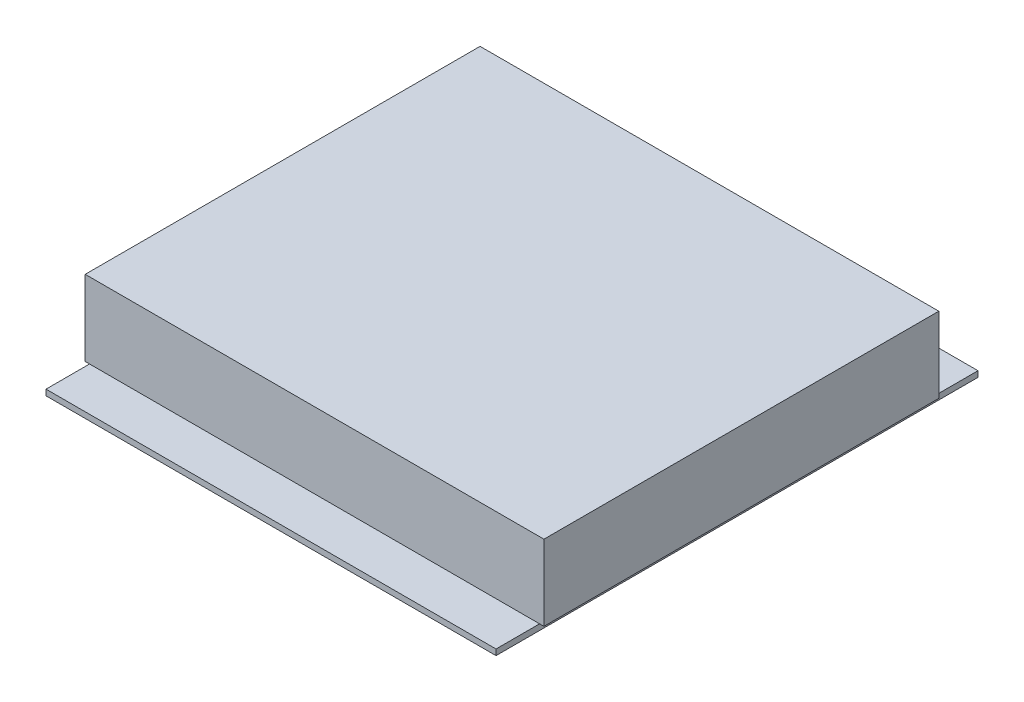
ISO-10303-21;
HEADER;
FILE_DESCRIPTION(('STEP AP214'),'2;1');
FILE_NAME('part.step','',(''),(''),'','','');
FILE_SCHEMA(('AUTOMOTIVE_DESIGN { 1 0 10303 214 1 1 1 1 }'));
ENDSEC;
DATA;
#1=APPLICATION_CONTEXT('core data for automotive mechanical design processes');
#2=APPLICATION_PROTOCOL_DEFINITION('international standard','automotive_design',2000,#1);
#3=PRODUCT_CONTEXT('',#1,'mechanical');
#4=PRODUCT('Part','Part','',(#3));
#5=PRODUCT_RELATED_PRODUCT_CATEGORY('part','',(#4));
#6=PRODUCT_DEFINITION_FORMATION('','',#4);
#7=PRODUCT_DEFINITION_CONTEXT('part definition',#1,'design');
#8=PRODUCT_DEFINITION('design','',#6,#7);
#9=PRODUCT_DEFINITION_SHAPE('','',#8);
#10=(LENGTH_UNIT() NAMED_UNIT(*) SI_UNIT(.MILLI.,.METRE.));
#11=(NAMED_UNIT(*) PLANE_ANGLE_UNIT() SI_UNIT($,.RADIAN.));
#12=(NAMED_UNIT(*) SI_UNIT($,.STERADIAN.) SOLID_ANGLE_UNIT());
#13=UNCERTAINTY_MEASURE_WITH_UNIT(LENGTH_MEASURE(1.E-05),#10,'distance_accuracy_value','');
#14=(GEOMETRIC_REPRESENTATION_CONTEXT(3) GLOBAL_UNCERTAINTY_ASSIGNED_CONTEXT((#13)) GLOBAL_UNIT_ASSIGNED_CONTEXT((#10,
#11,#12)) REPRESENTATION_CONTEXT('',''));
#15=CARTESIAN_POINT('',(0.,0.,0.));
#16=DIRECTION('',(0.,0.,1.));
#17=DIRECTION('',(1.,0.,0.));
#18=AXIS2_PLACEMENT_3D('',#15,#16,#17);
#19=CARTESIAN_POINT('',(-79.,0.,-68.));
#20=DIRECTION('',(0.,1.,0.));
#21=DIRECTION('',(0.,0.,1.));
#22=AXIS2_PLACEMENT_3D('',#19,#20,#21);
#23=PLANE('',#22);
#24=DIRECTION('',(0.,0.,-1.));
#25=VECTOR('',#24,1.);
#26=CARTESIAN_POINT('',(-77.5,0.,83.));
#27=LINE('',#26,#25);
#28=CARTESIAN_POINT('',(-77.5,0.,68.));
#29=VERTEX_POINT('',#28);
#30=CARTESIAN_POINT('',(-77.5,0.,-68.));
#31=VERTEX_POINT('',#30);
#32=EDGE_CURVE('E11',#29,#31,#27,.T.);
#33=ORIENTED_EDGE('',*,*,#32,.F.);
#34=DIRECTION('',(1.,0.,0.));
#35=VECTOR('',#34,1.);
#36=CARTESIAN_POINT('',(-79.,0.,68.));
#37=LINE('',#36,#35);
#38=CARTESIAN_POINT('',(-79.,0.,68.));
#39=VERTEX_POINT('',#38);
#40=EDGE_CURVE('E138',#39,#29,#37,.T.);
#41=ORIENTED_EDGE('',*,*,#40,.F.);
#42=DIRECTION('',(0.,0.,1.));
#43=VECTOR('',#42,1.);
#44=CARTESIAN_POINT('',(-79.,0.,-68.));
#45=LINE('',#44,#43);
#46=CARTESIAN_POINT('',(-79.,0.,-68.));
#47=VERTEX_POINT('',#46);
#48=EDGE_CURVE('E128',#47,#39,#45,.T.);
#49=ORIENTED_EDGE('',*,*,#48,.F.);
#50=DIRECTION('',(-1.,0.,0.));
#51=VECTOR('',#50,1.);
#52=CARTESIAN_POINT('',(-79.,0.,-68.));
#53=LINE('',#52,#51);
#54=EDGE_CURVE('E51',#31,#47,#53,.T.);
#55=ORIENTED_EDGE('',*,*,#54,.F.);
#56=EDGE_LOOP('',(#33,#41,#49,#55));
#57=FACE_BOUND('',#56,.T.);
#58=ADVANCED_FACE('F29',(#57),#23,.F.);
#59=DIRECTION('',(0.,0.,1.));
#60=VECTOR('',#59,1.);
#61=CARTESIAN_POINT('',(77.5000000000001,0.,83.));
#62=LINE('',#61,#60);
#63=CARTESIAN_POINT('',(77.5000000000001,0.,-68.));
#64=VERTEX_POINT('',#63);
#65=CARTESIAN_POINT('',(77.5000000000001,0.,68.));
#66=VERTEX_POINT('',#65);
#67=EDGE_CURVE('E38',#64,#66,#62,.T.);
#68=ORIENTED_EDGE('',*,*,#67,.F.);
#69=CARTESIAN_POINT('',(79.,0.,-68.));
#70=VERTEX_POINT('',#69);
#71=EDGE_CURVE('E143',#70,#64,#53,.T.);
#72=ORIENTED_EDGE('',*,*,#71,.F.);
#73=DIRECTION('',(0.,0.,-1.));
#74=VECTOR('',#73,1.);
#75=CARTESIAN_POINT('',(79.,0.,-68.));
#76=LINE('',#75,#74);
#77=CARTESIAN_POINT('',(79.0000000000001,0.,68.));
#78=VERTEX_POINT('',#77);
#79=EDGE_CURVE('E140',#78,#70,#76,.T.);
#80=ORIENTED_EDGE('',*,*,#79,.F.);
#81=EDGE_CURVE('E132',#66,#78,#37,.T.);
#82=ORIENTED_EDGE('',*,*,#81,.F.);
#83=EDGE_LOOP('',(#68,#72,#80,#82));
#84=FACE_BOUND('',#83,.T.);
#85=ADVANCED_FACE('F210',(#84),#23,.F.);
#86=CARTESIAN_POINT('',(-79.,26.,-68.));
#87=DIRECTION('',(1.,0.,0.));
#88=DIRECTION('',(0.,0.,-1.));
#89=AXIS2_PLACEMENT_3D('',#86,#87,#88);
#90=PLANE('',#89);
#91=ORIENTED_EDGE('',*,*,#48,.T.);
#92=DIRECTION('',(0.,-1.,0.));
#93=VECTOR('',#92,1.);
#94=CARTESIAN_POINT('',(-79.,26.,68.));
#95=LINE('',#94,#93);
#96=CARTESIAN_POINT('',(-79.,26.,68.));
#97=VERTEX_POINT('',#96);
#98=EDGE_CURVE('E33',#97,#39,#95,.T.);
#99=ORIENTED_EDGE('',*,*,#98,.F.);
#100=DIRECTION('',(0.,0.,1.));
#101=VECTOR('',#100,1.);
#102=CARTESIAN_POINT('',(-79.,26.,-68.));
#103=LINE('',#102,#101);
#104=CARTESIAN_POINT('',(-79.,26.,-68.));
#105=VERTEX_POINT('',#104);
#106=EDGE_CURVE('E146',#105,#97,#103,.T.);
#107=ORIENTED_EDGE('',*,*,#106,.F.);
#108=DIRECTION('',(0.,-1.,0.));
#109=VECTOR('',#108,1.);
#110=CARTESIAN_POINT('',(-79.,26.,-68.));
#111=LINE('',#110,#109);
#112=EDGE_CURVE('E156',#105,#47,#111,.T.);
#113=ORIENTED_EDGE('',*,*,#112,.T.);
#114=EDGE_LOOP('',(#91,#99,#107,#113));
#115=FACE_BOUND('',#114,.T.);
#116=ADVANCED_FACE('F31',(#115),#90,.F.);
#117=CARTESIAN_POINT('',(-79.,26.,68.));
#118=DIRECTION('',(0.,0.,-1.));
#119=DIRECTION('',(-1.,0.,0.));
#120=AXIS2_PLACEMENT_3D('',#117,#118,#119);
#121=PLANE('',#120);
#122=ORIENTED_EDGE('',*,*,#40,.T.);
#123=EDGE_CURVE('E141',#29,#66,#37,.T.);
#124=ORIENTED_EDGE('',*,*,#123,.T.);
#125=ORIENTED_EDGE('',*,*,#81,.T.);
#126=DIRECTION('',(0.,-1.,0.));
#127=VECTOR('',#126,1.);
#128=CARTESIAN_POINT('',(79.0000000000001,26.,68.));
#129=LINE('',#128,#127);
#130=CARTESIAN_POINT('',(79.0000000000001,26.,68.));
#131=VERTEX_POINT('',#130);
#132=EDGE_CURVE('E161',#131,#78,#129,.T.);
#133=ORIENTED_EDGE('',*,*,#132,.F.);
#134=DIRECTION('',(1.,0.,0.));
#135=VECTOR('',#134,1.);
#136=CARTESIAN_POINT('',(-79.,26.,68.));
#137=LINE('',#136,#135);
#138=EDGE_CURVE('E150',#97,#131,#137,.T.);
#139=ORIENTED_EDGE('',*,*,#138,.F.);
#140=ORIENTED_EDGE('',*,*,#98,.T.);
#141=EDGE_LOOP('',(#122,#124,#125,#133,#139,#140));
#142=FACE_BOUND('',#141,.T.);
#143=ADVANCED_FACE('F229',(#142),#121,.F.);
#144=CARTESIAN_POINT('',(79.,26.,-68.));
#145=DIRECTION('',(-1.,0.,0.));
#146=DIRECTION('',(0.,0.,1.));
#147=AXIS2_PLACEMENT_3D('',#144,#145,#146);
#148=PLANE('',#147);
#149=ORIENTED_EDGE('',*,*,#79,.T.);
#150=DIRECTION('',(0.,-1.,0.));
#151=VECTOR('',#150,1.);
#152=CARTESIAN_POINT('',(79.,26.,-68.));
#153=LINE('',#152,#151);
#154=CARTESIAN_POINT('',(79.,26.,-68.));
#155=VERTEX_POINT('',#154);
#156=EDGE_CURVE('E159',#155,#70,#153,.T.);
#157=ORIENTED_EDGE('',*,*,#156,.F.);
#158=DIRECTION('',(0.,0.,-1.));
#159=VECTOR('',#158,1.);
#160=CARTESIAN_POINT('',(79.,26.,-68.));
#161=LINE('',#160,#159);
#162=EDGE_CURVE('E152',#131,#155,#161,.T.);
#163=ORIENTED_EDGE('',*,*,#162,.F.);
#164=ORIENTED_EDGE('',*,*,#132,.T.);
#165=EDGE_LOOP('',(#149,#157,#163,#164));
#166=FACE_BOUND('',#165,.T.);
#167=ADVANCED_FACE('F226',(#166),#148,.F.);
#168=CARTESIAN_POINT('',(-79.,26.,-68.));
#169=DIRECTION('',(0.,0.,1.));
#170=DIRECTION('',(1.,0.,0.));
#171=AXIS2_PLACEMENT_3D('',#168,#169,#170);
#172=PLANE('',#171);
#173=ORIENTED_EDGE('',*,*,#71,.T.);
#174=EDGE_CURVE('E147',#64,#31,#53,.T.);
#175=ORIENTED_EDGE('',*,*,#174,.T.);
#176=ORIENTED_EDGE('',*,*,#54,.T.);
#177=ORIENTED_EDGE('',*,*,#112,.F.);
#178=DIRECTION('',(-1.,0.,0.));
#179=VECTOR('',#178,1.);
#180=CARTESIAN_POINT('',(-79.,26.,-68.));
#181=LINE('',#180,#179);
#182=EDGE_CURVE('E154',#155,#105,#181,.T.);
#183=ORIENTED_EDGE('',*,*,#182,.F.);
#184=ORIENTED_EDGE('',*,*,#156,.T.);
#185=EDGE_LOOP('',(#173,#175,#176,#177,#183,#184));
#186=FACE_BOUND('',#185,.T.);
#187=ADVANCED_FACE('F222',(#186),#172,.F.);
#188=CARTESIAN_POINT('',(-79.,26.,-68.));
#189=DIRECTION('',(0.,1.,0.));
#190=DIRECTION('',(0.,0.,1.));
#191=AXIS2_PLACEMENT_3D('',#188,#189,#190);
#192=PLANE('',#191);
#193=ORIENTED_EDGE('',*,*,#106,.T.);
#194=ORIENTED_EDGE('',*,*,#138,.T.);
#195=ORIENTED_EDGE('',*,*,#162,.T.);
#196=ORIENTED_EDGE('',*,*,#182,.T.);
#197=EDGE_LOOP('',(#193,#194,#195,#196));
#198=FACE_BOUND('',#197,.T.);
#199=ADVANCED_FACE('F220',(#198),#192,.T.);
#200=CARTESIAN_POINT('',(-77.5,0.,-83.));
#201=DIRECTION('',(0.,-1.,0.));
#202=DIRECTION('',(0.,0.,-1.));
#203=AXIS2_PLACEMENT_3D('',#200,#201,#202);
#204=PLANE('',#203);
#205=ORIENTED_EDGE('',*,*,#174,.F.);
#206=CARTESIAN_POINT('',(77.5000000000001,0.,-83.));
#207=VERTEX_POINT('',#206);
#208=EDGE_CURVE('E119',#207,#64,#62,.T.);
#209=ORIENTED_EDGE('',*,*,#208,.F.);
#210=DIRECTION('',(1.,0.,0.));
#211=VECTOR('',#210,1.);
#212=CARTESIAN_POINT('',(-77.5,0.,-83.));
#213=LINE('',#212,#211);
#214=CARTESIAN_POINT('',(-77.5,0.,-83.));
#215=VERTEX_POINT('',#214);
#216=EDGE_CURVE('E116',#215,#207,#213,.T.);
#217=ORIENTED_EDGE('',*,*,#216,.F.);
#218=EDGE_CURVE('E41',#31,#215,#27,.T.);
#219=ORIENTED_EDGE('',*,*,#218,.F.);
#220=EDGE_LOOP('',(#205,#209,#217,#219));
#221=FACE_BOUND('',#220,.T.);
#222=ADVANCED_FACE('F117',(#221),#204,.F.);
#223=CARTESIAN_POINT('',(-77.5,-2.,83.));
#224=DIRECTION('',(1.,0.,0.));
#225=DIRECTION('',(0.,0.,-1.));
#226=AXIS2_PLACEMENT_3D('',#223,#224,#225);
#227=PLANE('',#226);
#228=CARTESIAN_POINT('',(-77.5,0.,83.));
#229=VERTEX_POINT('',#228);
#230=EDGE_CURVE('E40',#229,#29,#27,.T.);
#231=ORIENTED_EDGE('',*,*,#230,.T.);
#232=ORIENTED_EDGE('',*,*,#32,.T.);
#233=ORIENTED_EDGE('',*,*,#218,.T.);
#234=DIRECTION('',(0.,1.,0.));
#235=VECTOR('',#234,1.);
#236=CARTESIAN_POINT('',(-77.5,-2.,-83.));
#237=LINE('',#236,#235);
#238=CARTESIAN_POINT('',(-77.5,-2.,-83.));
#239=VERTEX_POINT('',#238);
#240=EDGE_CURVE('E112',#239,#215,#237,.T.);
#241=ORIENTED_EDGE('',*,*,#240,.F.);
#242=DIRECTION('',(0.,0.,-1.));
#243=VECTOR('',#242,1.);
#244=CARTESIAN_POINT('',(-77.5,-2.,83.));
#245=LINE('',#244,#243);
#246=CARTESIAN_POINT('',(-77.5,-2.,83.));
#247=VERTEX_POINT('',#246);
#248=EDGE_CURVE('E192',#247,#239,#245,.T.);
#249=ORIENTED_EDGE('',*,*,#248,.F.);
#250=DIRECTION('',(0.,1.,0.));
#251=VECTOR('',#250,1.);
#252=CARTESIAN_POINT('',(-77.5,-2.,83.));
#253=LINE('',#252,#251);
#254=EDGE_CURVE('E189',#247,#229,#253,.T.);
#255=ORIENTED_EDGE('',*,*,#254,.T.);
#256=EDGE_LOOP('',(#231,#232,#233,#241,#249,#255));
#257=FACE_BOUND('',#256,.T.);
#258=ADVANCED_FACE('F109',(#257),#227,.F.);
#259=CARTESIAN_POINT('',(-77.5,-2.,-83.));
#260=DIRECTION('',(0.,0.,1.));
#261=DIRECTION('',(1.,0.,0.));
#262=AXIS2_PLACEMENT_3D('',#259,#260,#261);
#263=PLANE('',#262);
#264=ORIENTED_EDGE('',*,*,#216,.T.);
#265=DIRECTION('',(0.,1.,0.));
#266=VECTOR('',#265,1.);
#267=CARTESIAN_POINT('',(77.5000000000001,-2.,-83.));
#268=LINE('',#267,#266);
#269=CARTESIAN_POINT('',(77.5000000000001,-2.,-83.));
#270=VERTEX_POINT('',#269);
#271=EDGE_CURVE('E129',#270,#207,#268,.T.);
#272=ORIENTED_EDGE('',*,*,#271,.F.);
#273=DIRECTION('',(1.,0.,0.));
#274=VECTOR('',#273,1.);
#275=CARTESIAN_POINT('',(-77.5,-2.,-83.));
#276=LINE('',#275,#274);
#277=EDGE_CURVE('E126',#239,#270,#276,.T.);
#278=ORIENTED_EDGE('',*,*,#277,.F.);
#279=ORIENTED_EDGE('',*,*,#240,.T.);
#280=EDGE_LOOP('',(#264,#272,#278,#279));
#281=FACE_BOUND('',#280,.T.);
#282=ADVANCED_FACE('F125',(#281),#263,.F.);
#283=CARTESIAN_POINT('',(77.5000000000001,-2.,83.));
#284=DIRECTION('',(-1.,0.,0.));
#285=DIRECTION('',(0.,0.,1.));
#286=AXIS2_PLACEMENT_3D('',#283,#284,#285);
#287=PLANE('',#286);
#288=ORIENTED_EDGE('',*,*,#208,.T.);
#289=ORIENTED_EDGE('',*,*,#67,.T.);
#290=CARTESIAN_POINT('',(77.5000000000001,0.,83.));
#291=VERTEX_POINT('',#290);
#292=EDGE_CURVE('E123',#66,#291,#62,.T.);
#293=ORIENTED_EDGE('',*,*,#292,.T.);
#294=DIRECTION('',(0.,1.,0.));
#295=VECTOR('',#294,1.);
#296=CARTESIAN_POINT('',(77.5000000000001,-2.,83.));
#297=LINE('',#296,#295);
#298=CARTESIAN_POINT('',(77.5000000000001,-2.,83.));
#299=VERTEX_POINT('',#298);
#300=EDGE_CURVE('E134',#299,#291,#297,.T.);
#301=ORIENTED_EDGE('',*,*,#300,.F.);
#302=DIRECTION('',(0.,0.,1.));
#303=VECTOR('',#302,1.);
#304=CARTESIAN_POINT('',(77.5000000000001,-2.,83.));
#305=LINE('',#304,#303);
#306=EDGE_CURVE('E196',#270,#299,#305,.T.);
#307=ORIENTED_EDGE('',*,*,#306,.F.);
#308=ORIENTED_EDGE('',*,*,#271,.T.);
#309=EDGE_LOOP('',(#288,#289,#293,#301,#307,#308));
#310=FACE_BOUND('',#309,.T.);
#311=ADVANCED_FACE('F178',(#310),#287,.F.);
#312=CARTESIAN_POINT('',(-77.5,-2.,83.));
#313=DIRECTION('',(0.,0.,-1.));
#314=DIRECTION('',(-1.,0.,0.));
#315=AXIS2_PLACEMENT_3D('',#312,#313,#314);
#316=PLANE('',#315);
#317=DIRECTION('',(-1.,0.,0.));
#318=VECTOR('',#317,1.);
#319=CARTESIAN_POINT('',(-77.5,0.,83.));
#320=LINE('',#319,#318);
#321=EDGE_CURVE('E174',#291,#229,#320,.T.);
#322=ORIENTED_EDGE('',*,*,#321,.T.);
#323=ORIENTED_EDGE('',*,*,#254,.F.);
#324=DIRECTION('',(-1.,0.,0.));
#325=VECTOR('',#324,1.);
#326=CARTESIAN_POINT('',(-77.5,-2.,83.));
#327=LINE('',#326,#325);
#328=EDGE_CURVE('E188',#299,#247,#327,.T.);
#329=ORIENTED_EDGE('',*,*,#328,.F.);
#330=ORIENTED_EDGE('',*,*,#300,.T.);
#331=EDGE_LOOP('',(#322,#323,#329,#330));
#332=FACE_BOUND('',#331,.T.);
#333=ADVANCED_FACE('F185',(#332),#316,.F.);
#334=CARTESIAN_POINT('',(-77.5,-2.,-83.));
#335=DIRECTION('',(0.,-1.,0.));
#336=DIRECTION('',(0.,0.,-1.));
#337=AXIS2_PLACEMENT_3D('',#334,#335,#336);
#338=PLANE('',#337);
#339=ORIENTED_EDGE('',*,*,#248,.T.);
#340=ORIENTED_EDGE('',*,*,#277,.T.);
#341=ORIENTED_EDGE('',*,*,#306,.T.);
#342=ORIENTED_EDGE('',*,*,#328,.T.);
#343=EDGE_LOOP('',(#339,#340,#341,#342));
#344=FACE_BOUND('',#343,.T.);
#345=ADVANCED_FACE('F200',(#344),#338,.T.);
#346=ORIENTED_EDGE('',*,*,#123,.F.);
#347=ORIENTED_EDGE('',*,*,#230,.F.);
#348=ORIENTED_EDGE('',*,*,#321,.F.);
#349=ORIENTED_EDGE('',*,*,#292,.F.);
#350=EDGE_LOOP('',(#346,#347,#348,#349));
#351=FACE_BOUND('',#350,.T.);
#352=ADVANCED_FACE('F191',(#351),#204,.F.);
#353=CLOSED_SHELL('',(#58,#85,#116,#143,#167,#187,#199,#222,#258,#282,#311,#333,#345,#352));
#354=MANIFOLD_SOLID_BREP('B2',#353);
#355=ADVANCED_BREP_SHAPE_REPRESENTATION('',(#18,#354),#14);
#356=SHAPE_DEFINITION_REPRESENTATION(#9,#355);
ENDSEC;
END-ISO-10303-21;
